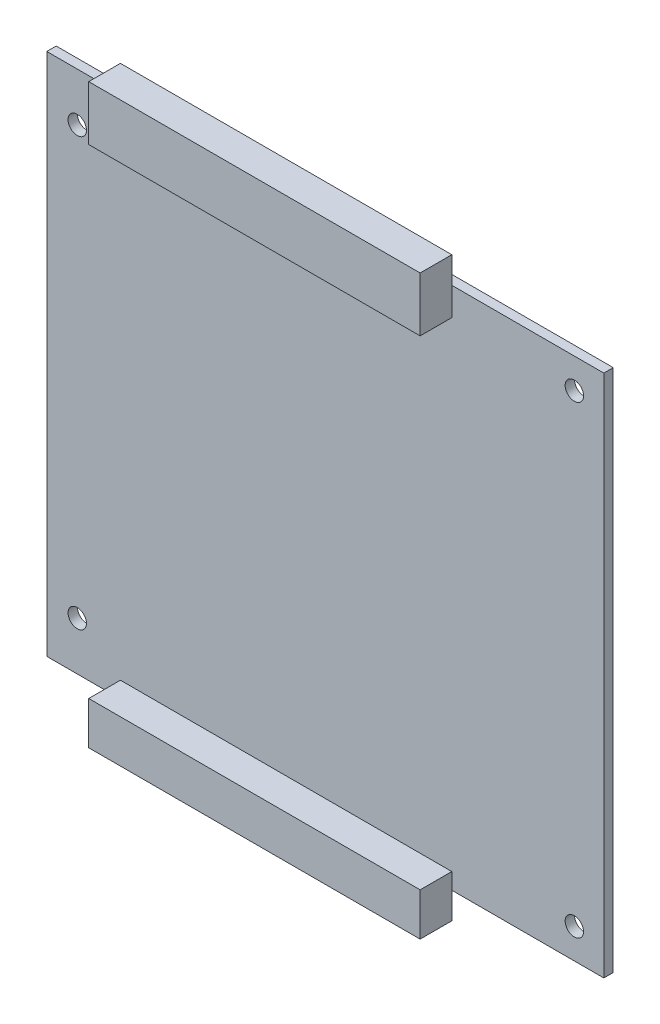
ISO-10303-21;
HEADER;
FILE_DESCRIPTION(('STEP AP214'),'2;1');
FILE_NAME('part.step','',(''),(''),'','','');
FILE_SCHEMA(('AUTOMOTIVE_DESIGN { 1 0 10303 214 1 1 1 1 }'));
ENDSEC;
DATA;
#1=APPLICATION_CONTEXT('core data for automotive mechanical design processes');
#2=APPLICATION_PROTOCOL_DEFINITION('international standard','automotive_design',2000,#1);
#3=PRODUCT_CONTEXT('',#1,'mechanical');
#4=PRODUCT('Part','Part','',(#3));
#5=PRODUCT_RELATED_PRODUCT_CATEGORY('part','',(#4));
#6=PRODUCT_DEFINITION_FORMATION('','',#4);
#7=PRODUCT_DEFINITION_CONTEXT('part definition',#1,'design');
#8=PRODUCT_DEFINITION('design','',#6,#7);
#9=PRODUCT_DEFINITION_SHAPE('','',#8);
#10=(LENGTH_UNIT() NAMED_UNIT(*) SI_UNIT(.MILLI.,.METRE.));
#11=(NAMED_UNIT(*) PLANE_ANGLE_UNIT() SI_UNIT($,.RADIAN.));
#12=(NAMED_UNIT(*) SI_UNIT($,.STERADIAN.) SOLID_ANGLE_UNIT());
#13=UNCERTAINTY_MEASURE_WITH_UNIT(LENGTH_MEASURE(1.E-05),#10,'distance_accuracy_value','');
#14=(GEOMETRIC_REPRESENTATION_CONTEXT(3) GLOBAL_UNCERTAINTY_ASSIGNED_CONTEXT((#13)) GLOBAL_UNIT_ASSIGNED_CONTEXT((#10,
#11,#12)) REPRESENTATION_CONTEXT('',''));
#15=CARTESIAN_POINT('',(0.,0.,0.));
#16=DIRECTION('',(0.,0.,1.));
#17=DIRECTION('',(1.,0.,0.));
#18=AXIS2_PLACEMENT_3D('',#15,#16,#17);
#19=CARTESIAN_POINT('',(48.0314,45.1739,1.6256));
#20=DIRECTION('',(0.,0.,-1.));
#21=DIRECTION('',(-1.,0.,0.));
#22=AXIS2_PLACEMENT_3D('',#19,#20,#21);
#23=PLANE('',#22);
#24=CARTESIAN_POINT('',(-42.7736,-36.83,1.6256));
#25=DIRECTION('',(0.,0.,1.));
#26=DIRECTION('',(1.,0.,0.));
#27=AXIS2_PLACEMENT_3D('',#24,#25,#26);
#28=CIRCLE('',#27,1.5875);
#29=CARTESIAN_POINT('',(-41.1861,-36.83,1.6256));
#30=VERTEX_POINT('',#29);
#31=EDGE_CURVE('E204',#30,#30,#28,.T.);
#32=ORIENTED_EDGE('',*,*,#31,.F.);
#33=EDGE_LOOP('',(#32));
#34=FACE_BOUND('',#33,.T.);
#35=CARTESIAN_POINT('',(42.9514,-40.005,1.6256));
#36=DIRECTION('',(0.,0.,1.));
#37=DIRECTION('',(1.,0.,0.));
#38=AXIS2_PLACEMENT_3D('',#35,#36,#37);
#39=CIRCLE('',#38,1.5875);
#40=CARTESIAN_POINT('',(44.5389,-40.005,1.6256));
#41=VERTEX_POINT('',#40);
#42=EDGE_CURVE('E208',#41,#41,#39,.T.);
#43=ORIENTED_EDGE('',*,*,#42,.F.);
#44=EDGE_LOOP('',(#43));
#45=FACE_BOUND('',#44,.T.);
#46=CARTESIAN_POINT('',(42.9514,40.005,1.6256));
#47=DIRECTION('',(0.,0.,1.));
#48=DIRECTION('',(1.,0.,0.));
#49=AXIS2_PLACEMENT_3D('',#46,#47,#48);
#50=CIRCLE('',#49,1.5875);
#51=CARTESIAN_POINT('',(44.5389,40.005,1.6256));
#52=VERTEX_POINT('',#51);
#53=EDGE_CURVE('E214',#52,#52,#50,.T.);
#54=ORIENTED_EDGE('',*,*,#53,.F.);
#55=EDGE_LOOP('',(#54));
#56=FACE_BOUND('',#55,.T.);
#57=CARTESIAN_POINT('',(-42.7736,36.83,1.6256));
#58=DIRECTION('',(0.,0.,1.));
#59=DIRECTION('',(1.,0.,0.));
#60=AXIS2_PLACEMENT_3D('',#57,#58,#59);
#61=CIRCLE('',#60,1.5875);
#62=CARTESIAN_POINT('',(-41.1861,36.83,1.6256));
#63=VERTEX_POINT('',#62);
#64=EDGE_CURVE('E220',#63,#63,#61,.T.);
#65=ORIENTED_EDGE('',*,*,#64,.F.);
#66=EDGE_LOOP('',(#65));
#67=FACE_BOUND('',#66,.T.);
#68=DIRECTION('',(0.,-1.,0.));
#69=VECTOR('',#68,1.);
#70=CARTESIAN_POINT('',(-35.3314,40.3479,1.6256));
#71=LINE('',#70,#69);
#72=CARTESIAN_POINT('',(-35.3314,45.1739,1.6256));
#73=VERTEX_POINT('',#72);
#74=CARTESIAN_POINT('',(-35.3314,40.3479,1.6256));
#75=VERTEX_POINT('',#74);
#76=EDGE_CURVE('E167',#73,#75,#71,.T.);
#77=ORIENTED_EDGE('',*,*,#76,.F.);
#78=DIRECTION('',(-1.,0.,0.));
#79=VECTOR('',#78,1.);
#80=CARTESIAN_POINT('',(-48.0314,45.1739,1.6256));
#81=LINE('',#80,#79);
#82=CARTESIAN_POINT('',(-48.0314,45.1739,1.6256));
#83=VERTEX_POINT('',#82);
#84=EDGE_CURVE('E232',#73,#83,#81,.T.);
#85=ORIENTED_EDGE('',*,*,#84,.T.);
#86=DIRECTION('',(0.,-1.,0.));
#87=VECTOR('',#86,1.);
#88=CARTESIAN_POINT('',(-48.0314,-45.1739,1.6256));
#89=LINE('',#88,#87);
#90=CARTESIAN_POINT('',(-48.0314,-45.1739,1.6256));
#91=VERTEX_POINT('',#90);
#92=EDGE_CURVE('E236',#83,#91,#89,.T.);
#93=ORIENTED_EDGE('',*,*,#92,.T.);
#94=DIRECTION('',(1.,0.,0.));
#95=VECTOR('',#94,1.);
#96=CARTESIAN_POINT('',(-48.0314,-45.1739,1.6256));
#97=LINE('',#96,#95);
#98=CARTESIAN_POINT('',(-35.3314,-45.1739,1.6256));
#99=VERTEX_POINT('',#98);
#100=EDGE_CURVE('E240',#91,#99,#97,.T.);
#101=ORIENTED_EDGE('',*,*,#100,.T.);
#102=DIRECTION('',(0.,-1.,0.));
#103=VECTOR('',#102,1.);
#104=CARTESIAN_POINT('',(-35.3314,-42.3799,1.6256));
#105=LINE('',#104,#103);
#106=CARTESIAN_POINT('',(-35.3314,-42.3799,1.6256));
#107=VERTEX_POINT('',#106);
#108=EDGE_CURVE('E170',#107,#99,#105,.T.);
#109=ORIENTED_EDGE('',*,*,#108,.F.);
#110=DIRECTION('',(-1.,0.,0.));
#111=VECTOR('',#110,1.);
#112=CARTESIAN_POINT('',(-35.3314,-42.3799,1.6256));
#113=LINE('',#112,#111);
#114=CARTESIAN_POINT('',(21.8186,-42.3799,1.6256));
#115=VERTEX_POINT('',#114);
#116=EDGE_CURVE('E180',#115,#107,#113,.T.);
#117=ORIENTED_EDGE('',*,*,#116,.F.);
#118=DIRECTION('',(0.,1.,0.));
#119=VECTOR('',#118,1.);
#120=CARTESIAN_POINT('',(21.8186,-42.3799,1.6256));
#121=LINE('',#120,#119);
#122=CARTESIAN_POINT('',(21.8186,-45.1739,1.6256));
#123=VERTEX_POINT('',#122);
#124=EDGE_CURVE('E11',#123,#115,#121,.T.);
#125=ORIENTED_EDGE('',*,*,#124,.F.);
#126=CARTESIAN_POINT('',(48.0314,-45.1739,1.6256));
#127=VERTEX_POINT('',#126);
#128=EDGE_CURVE('E239',#123,#127,#97,.T.);
#129=ORIENTED_EDGE('',*,*,#128,.T.);
#130=DIRECTION('',(0.,1.,0.));
#131=VECTOR('',#130,1.);
#132=CARTESIAN_POINT('',(48.0314,-45.1739,1.6256));
#133=LINE('',#132,#131);
#134=CARTESIAN_POINT('',(48.0314,45.1739,1.6256));
#135=VERTEX_POINT('',#134);
#136=EDGE_CURVE('E229',#127,#135,#133,.T.);
#137=ORIENTED_EDGE('',*,*,#136,.T.);
#138=CARTESIAN_POINT('',(21.8186,45.1739,1.6256));
#139=VERTEX_POINT('',#138);
#140=EDGE_CURVE('E234',#135,#139,#81,.T.);
#141=ORIENTED_EDGE('',*,*,#140,.T.);
#142=DIRECTION('',(0.,1.,0.));
#143=VECTOR('',#142,1.);
#144=CARTESIAN_POINT('',(21.8186,40.3479,1.6256));
#145=LINE('',#144,#143);
#146=CARTESIAN_POINT('',(21.8186,40.3479,1.6256));
#147=VERTEX_POINT('',#146);
#148=EDGE_CURVE('E62',#147,#139,#145,.T.);
#149=ORIENTED_EDGE('',*,*,#148,.F.);
#150=DIRECTION('',(1.,0.,0.));
#151=VECTOR('',#150,1.);
#152=CARTESIAN_POINT('',(-35.3314,40.3479,1.6256));
#153=LINE('',#152,#151);
#154=EDGE_CURVE('E57',#75,#147,#153,.T.);
#155=ORIENTED_EDGE('',*,*,#154,.F.);
#156=EDGE_LOOP('',(#77,#85,#93,#101,#109,#117,#125,#129,#137,#141,#149,#155));
#157=FACE_BOUND('',#156,.T.);
#158=ADVANCED_FACE('F40',(#34,#45,#56,#67,#157),#23,.F.);
#159=CARTESIAN_POINT('',(48.0314,-45.1739,1.6256));
#160=DIRECTION('',(-1.,0.,0.));
#161=DIRECTION('',(0.,0.,1.));
#162=AXIS2_PLACEMENT_3D('',#159,#160,#161);
#163=PLANE('',#162);
#164=DIRECTION('',(0.,1.,0.));
#165=VECTOR('',#164,1.);
#166=CARTESIAN_POINT('',(48.0314,-45.1739,0.));
#167=LINE('',#166,#165);
#168=CARTESIAN_POINT('',(48.0314,-45.1739,0.));
#169=VERTEX_POINT('',#168);
#170=CARTESIAN_POINT('',(48.0314,45.1739,0.));
#171=VERTEX_POINT('',#170);
#172=EDGE_CURVE('E226',#169,#171,#167,.T.);
#173=ORIENTED_EDGE('',*,*,#172,.T.);
#174=DIRECTION('',(0.,0.,-1.));
#175=VECTOR('',#174,1.);
#176=CARTESIAN_POINT('',(48.0314,45.1739,1.6256));
#177=LINE('',#176,#175);
#178=EDGE_CURVE('E44',#135,#171,#177,.T.);
#179=ORIENTED_EDGE('',*,*,#178,.F.);
#180=ORIENTED_EDGE('',*,*,#136,.F.);
#181=DIRECTION('',(0.,0.,-1.));
#182=VECTOR('',#181,1.);
#183=CARTESIAN_POINT('',(48.0314,-45.1739,1.6256));
#184=LINE('',#183,#182);
#185=EDGE_CURVE('E243',#127,#169,#184,.T.);
#186=ORIENTED_EDGE('',*,*,#185,.T.);
#187=EDGE_LOOP('',(#173,#179,#180,#186));
#188=FACE_BOUND('',#187,.T.);
#189=ADVANCED_FACE('F42',(#188),#163,.F.);
#190=CARTESIAN_POINT('',(-48.0314,45.1739,1.6256));
#191=DIRECTION('',(0.,-1.,0.));
#192=DIRECTION('',(0.,0.,-1.));
#193=AXIS2_PLACEMENT_3D('',#190,#191,#192);
#194=PLANE('',#193);
#195=DIRECTION('',(-1.,0.,0.));
#196=VECTOR('',#195,1.);
#197=CARTESIAN_POINT('',(-48.0314,45.1739,0.));
#198=LINE('',#197,#196);
#199=CARTESIAN_POINT('',(-48.0314,45.1739,0.));
#200=VERTEX_POINT('',#199);
#201=EDGE_CURVE('E247',#171,#200,#198,.T.);
#202=ORIENTED_EDGE('',*,*,#201,.T.);
#203=DIRECTION('',(0.,0.,-1.));
#204=VECTOR('',#203,1.);
#205=CARTESIAN_POINT('',(-48.0314,45.1739,1.6256));
#206=LINE('',#205,#204);
#207=EDGE_CURVE('E256',#83,#200,#206,.T.);
#208=ORIENTED_EDGE('',*,*,#207,.F.);
#209=ORIENTED_EDGE('',*,*,#84,.F.);
#210=EDGE_CURVE('E237',#139,#73,#81,.T.);
#211=ORIENTED_EDGE('',*,*,#210,.F.);
#212=ORIENTED_EDGE('',*,*,#140,.F.);
#213=ORIENTED_EDGE('',*,*,#178,.T.);
#214=EDGE_LOOP('',(#202,#208,#209,#211,#212,#213));
#215=FACE_BOUND('',#214,.T.);
#216=ADVANCED_FACE('F265',(#215),#194,.F.);
#217=CARTESIAN_POINT('',(-48.0314,-45.1739,1.6256));
#218=DIRECTION('',(1.,0.,0.));
#219=DIRECTION('',(0.,0.,-1.));
#220=AXIS2_PLACEMENT_3D('',#217,#218,#219);
#221=PLANE('',#220);
#222=DIRECTION('',(0.,-1.,0.));
#223=VECTOR('',#222,1.);
#224=CARTESIAN_POINT('',(-48.0314,-45.1739,0.));
#225=LINE('',#224,#223);
#226=CARTESIAN_POINT('',(-48.0314,-45.1739,0.));
#227=VERTEX_POINT('',#226);
#228=EDGE_CURVE('E249',#200,#227,#225,.T.);
#229=ORIENTED_EDGE('',*,*,#228,.T.);
#230=DIRECTION('',(0.,0.,-1.));
#231=VECTOR('',#230,1.);
#232=CARTESIAN_POINT('',(-48.0314,-45.1739,1.6256));
#233=LINE('',#232,#231);
#234=EDGE_CURVE('E254',#91,#227,#233,.T.);
#235=ORIENTED_EDGE('',*,*,#234,.F.);
#236=ORIENTED_EDGE('',*,*,#92,.F.);
#237=ORIENTED_EDGE('',*,*,#207,.T.);
#238=EDGE_LOOP('',(#229,#235,#236,#237));
#239=FACE_BOUND('',#238,.T.);
#240=ADVANCED_FACE('F274',(#239),#221,.F.);
#241=CARTESIAN_POINT('',(-48.0314,-45.1739,1.6256));
#242=DIRECTION('',(0.,1.,0.));
#243=DIRECTION('',(0.,0.,1.));
#244=AXIS2_PLACEMENT_3D('',#241,#242,#243);
#245=PLANE('',#244);
#246=DIRECTION('',(1.,0.,0.));
#247=VECTOR('',#246,1.);
#248=CARTESIAN_POINT('',(-48.0314,-45.1739,0.));
#249=LINE('',#248,#247);
#250=EDGE_CURVE('E233',#227,#169,#249,.T.);
#251=ORIENTED_EDGE('',*,*,#250,.T.);
#252=ORIENTED_EDGE('',*,*,#185,.F.);
#253=ORIENTED_EDGE('',*,*,#128,.F.);
#254=EDGE_CURVE('E244',#99,#123,#97,.T.);
#255=ORIENTED_EDGE('',*,*,#254,.F.);
#256=ORIENTED_EDGE('',*,*,#100,.F.);
#257=ORIENTED_EDGE('',*,*,#234,.T.);
#258=EDGE_LOOP('',(#251,#252,#253,#255,#256,#257));
#259=FACE_BOUND('',#258,.T.);
#260=ADVANCED_FACE('F277',(#259),#245,.F.);
#261=CARTESIAN_POINT('',(48.0314,45.1739,0.));
#262=DIRECTION('',(0.,0.,-1.));
#263=DIRECTION('',(-1.,0.,0.));
#264=AXIS2_PLACEMENT_3D('',#261,#262,#263);
#265=PLANE('',#264);
#266=CARTESIAN_POINT('',(-42.7736,-36.83,0.));
#267=DIRECTION('',(0.,0.,1.));
#268=DIRECTION('',(1.,0.,0.));
#269=AXIS2_PLACEMENT_3D('',#266,#267,#268);
#270=CIRCLE('',#269,1.5875);
#271=CARTESIAN_POINT('',(-41.1861,-36.83,0.));
#272=VERTEX_POINT('',#271);
#273=EDGE_CURVE('E205',#272,#272,#270,.T.);
#274=ORIENTED_EDGE('',*,*,#273,.T.);
#275=EDGE_LOOP('',(#274));
#276=FACE_BOUND('',#275,.T.);
#277=CARTESIAN_POINT('',(42.9514,-40.005,0.));
#278=DIRECTION('',(0.,0.,1.));
#279=DIRECTION('',(1.,0.,0.));
#280=AXIS2_PLACEMENT_3D('',#277,#278,#279);
#281=CIRCLE('',#280,1.5875);
#282=CARTESIAN_POINT('',(44.5389,-40.005,0.));
#283=VERTEX_POINT('',#282);
#284=EDGE_CURVE('E211',#283,#283,#281,.T.);
#285=ORIENTED_EDGE('',*,*,#284,.T.);
#286=EDGE_LOOP('',(#285));
#287=FACE_BOUND('',#286,.T.);
#288=CARTESIAN_POINT('',(42.9514,40.005,0.));
#289=DIRECTION('',(0.,0.,1.));
#290=DIRECTION('',(1.,0.,0.));
#291=AXIS2_PLACEMENT_3D('',#288,#289,#290);
#292=CIRCLE('',#291,1.5875);
#293=CARTESIAN_POINT('',(44.5389,40.005,0.));
#294=VERTEX_POINT('',#293);
#295=EDGE_CURVE('E217',#294,#294,#292,.T.);
#296=ORIENTED_EDGE('',*,*,#295,.T.);
#297=EDGE_LOOP('',(#296));
#298=FACE_BOUND('',#297,.T.);
#299=CARTESIAN_POINT('',(-42.7736,36.83,0.));
#300=DIRECTION('',(0.,0.,1.));
#301=DIRECTION('',(1.,0.,0.));
#302=AXIS2_PLACEMENT_3D('',#299,#300,#301);
#303=CIRCLE('',#302,1.5875);
#304=CARTESIAN_POINT('',(-41.1861,36.83,0.));
#305=VERTEX_POINT('',#304);
#306=EDGE_CURVE('E223',#305,#305,#303,.T.);
#307=ORIENTED_EDGE('',*,*,#306,.T.);
#308=EDGE_LOOP('',(#307));
#309=FACE_BOUND('',#308,.T.);
#310=ORIENTED_EDGE('',*,*,#172,.F.);
#311=ORIENTED_EDGE('',*,*,#250,.F.);
#312=ORIENTED_EDGE('',*,*,#228,.F.);
#313=ORIENTED_EDGE('',*,*,#201,.F.);
#314=EDGE_LOOP('',(#310,#311,#312,#313));
#315=FACE_BOUND('',#314,.T.);
#316=ADVANCED_FACE('F272',(#276,#287,#298,#309,#315),#265,.T.);
#317=CARTESIAN_POINT('',(-42.7736,36.83,0.));
#318=DIRECTION('',(0.,0.,1.));
#319=DIRECTION('',(1.,0.,0.));
#320=AXIS2_PLACEMENT_3D('',#317,#318,#319);
#321=CYLINDRICAL_SURFACE('',#320,1.5875);
#322=ORIENTED_EDGE('',*,*,#306,.F.);
#323=EDGE_LOOP('',(#322));
#324=FACE_BOUND('',#323,.T.);
#325=ORIENTED_EDGE('',*,*,#64,.T.);
#326=EDGE_LOOP('',(#325));
#327=FACE_BOUND('',#326,.T.);
#328=ADVANCED_FACE('F324',(#324,#327),#321,.F.);
#329=CARTESIAN_POINT('',(42.9514,40.005,0.));
#330=DIRECTION('',(0.,0.,1.));
#331=DIRECTION('',(1.,0.,0.));
#332=AXIS2_PLACEMENT_3D('',#329,#330,#331);
#333=CYLINDRICAL_SURFACE('',#332,1.5875);
#334=ORIENTED_EDGE('',*,*,#295,.F.);
#335=EDGE_LOOP('',(#334));
#336=FACE_BOUND('',#335,.T.);
#337=ORIENTED_EDGE('',*,*,#53,.T.);
#338=EDGE_LOOP('',(#337));
#339=FACE_BOUND('',#338,.T.);
#340=ADVANCED_FACE('F356',(#336,#339),#333,.F.);
#341=CARTESIAN_POINT('',(42.9514,-40.005,0.));
#342=DIRECTION('',(0.,0.,1.));
#343=DIRECTION('',(1.,0.,0.));
#344=AXIS2_PLACEMENT_3D('',#341,#342,#343);
#345=CYLINDRICAL_SURFACE('',#344,1.5875);
#346=ORIENTED_EDGE('',*,*,#284,.F.);
#347=EDGE_LOOP('',(#346));
#348=FACE_BOUND('',#347,.T.);
#349=ORIENTED_EDGE('',*,*,#42,.T.);
#350=EDGE_LOOP('',(#349));
#351=FACE_BOUND('',#350,.T.);
#352=ADVANCED_FACE('F363',(#348,#351),#345,.F.);
#353=CARTESIAN_POINT('',(-42.7736,-36.83,0.));
#354=DIRECTION('',(0.,0.,1.));
#355=DIRECTION('',(1.,0.,0.));
#356=AXIS2_PLACEMENT_3D('',#353,#354,#355);
#357=CYLINDRICAL_SURFACE('',#356,1.5875);
#358=ORIENTED_EDGE('',*,*,#273,.F.);
#359=EDGE_LOOP('',(#358));
#360=FACE_BOUND('',#359,.T.);
#361=ORIENTED_EDGE('',*,*,#31,.T.);
#362=EDGE_LOOP('',(#361));
#363=FACE_BOUND('',#362,.T.);
#364=ADVANCED_FACE('F370',(#360,#363),#357,.F.);
#365=CARTESIAN_POINT('',(-35.3314,-49.7459,1.6256));
#366=DIRECTION('',(0.,0.,1.));
#367=DIRECTION('',(1.,0.,0.));
#368=AXIS2_PLACEMENT_3D('',#365,#366,#367);
#369=PLANE('',#368);
#370=CARTESIAN_POINT('',(-35.3314,-49.7459,1.6256));
#371=VERTEX_POINT('',#370);
#372=EDGE_CURVE('E168',#99,#371,#105,.T.);
#373=ORIENTED_EDGE('',*,*,#372,.F.);
#374=ORIENTED_EDGE('',*,*,#254,.T.);
#375=CARTESIAN_POINT('',(21.8186,-49.7459,1.6256));
#376=VERTEX_POINT('',#375);
#377=EDGE_CURVE('E50',#376,#123,#121,.T.);
#378=ORIENTED_EDGE('',*,*,#377,.F.);
#379=DIRECTION('',(1.,0.,0.));
#380=VECTOR('',#379,1.);
#381=CARTESIAN_POINT('',(-35.3314,-49.7459,1.6256));
#382=LINE('',#381,#380);
#383=EDGE_CURVE('E188',#371,#376,#382,.T.);
#384=ORIENTED_EDGE('',*,*,#383,.F.);
#385=EDGE_LOOP('',(#373,#374,#378,#384));
#386=FACE_BOUND('',#385,.T.);
#387=ADVANCED_FACE('F283',(#386),#369,.F.);
#388=CARTESIAN_POINT('',(-35.3314,-42.3799,7.0866));
#389=DIRECTION('',(1.,0.,0.));
#390=DIRECTION('',(0.,0.,-1.));
#391=AXIS2_PLACEMENT_3D('',#388,#389,#390);
#392=PLANE('',#391);
#393=ORIENTED_EDGE('',*,*,#108,.T.);
#394=ORIENTED_EDGE('',*,*,#372,.T.);
#395=DIRECTION('',(0.,0.,-1.));
#396=VECTOR('',#395,1.);
#397=CARTESIAN_POINT('',(-35.3314,-49.7459,7.0866));
#398=LINE('',#397,#396);
#399=CARTESIAN_POINT('',(-35.3314,-49.7459,7.0866));
#400=VERTEX_POINT('',#399);
#401=EDGE_CURVE('E201',#400,#371,#398,.T.);
#402=ORIENTED_EDGE('',*,*,#401,.F.);
#403=DIRECTION('',(0.,-1.,0.));
#404=VECTOR('',#403,1.);
#405=CARTESIAN_POINT('',(-35.3314,-42.3799,7.0866));
#406=LINE('',#405,#404);
#407=CARTESIAN_POINT('',(-35.3314,-42.3799,7.0866));
#408=VERTEX_POINT('',#407);
#409=EDGE_CURVE('E176',#408,#400,#406,.T.);
#410=ORIENTED_EDGE('',*,*,#409,.F.);
#411=DIRECTION('',(0.,0.,-1.));
#412=VECTOR('',#411,1.);
#413=CARTESIAN_POINT('',(-35.3314,-42.3799,7.0866));
#414=LINE('',#413,#412);
#415=EDGE_CURVE('E185',#408,#107,#414,.T.);
#416=ORIENTED_EDGE('',*,*,#415,.T.);
#417=EDGE_LOOP('',(#393,#394,#402,#410,#416));
#418=FACE_BOUND('',#417,.T.);
#419=ADVANCED_FACE('F287',(#418),#392,.F.);
#420=CARTESIAN_POINT('',(-35.3314,-49.7459,7.0866));
#421=DIRECTION('',(0.,1.,0.));
#422=DIRECTION('',(0.,0.,1.));
#423=AXIS2_PLACEMENT_3D('',#420,#421,#422);
#424=PLANE('',#423);
#425=ORIENTED_EDGE('',*,*,#383,.T.);
#426=DIRECTION('',(0.,0.,-1.));
#427=VECTOR('',#426,1.);
#428=CARTESIAN_POINT('',(21.8186,-49.7459,7.0866));
#429=LINE('',#428,#427);
#430=CARTESIAN_POINT('',(21.8186,-49.7459,7.0866));
#431=VERTEX_POINT('',#430);
#432=EDGE_CURVE('E198',#431,#376,#429,.T.);
#433=ORIENTED_EDGE('',*,*,#432,.F.);
#434=DIRECTION('',(1.,0.,0.));
#435=VECTOR('',#434,1.);
#436=CARTESIAN_POINT('',(-35.3314,-49.7459,7.0866));
#437=LINE('',#436,#435);
#438=EDGE_CURVE('E179',#400,#431,#437,.T.);
#439=ORIENTED_EDGE('',*,*,#438,.F.);
#440=ORIENTED_EDGE('',*,*,#401,.T.);
#441=EDGE_LOOP('',(#425,#433,#439,#440));
#442=FACE_BOUND('',#441,.T.);
#443=ADVANCED_FACE('F299',(#442),#424,.F.);
#444=CARTESIAN_POINT('',(21.8186,-42.3799,7.0866));
#445=DIRECTION('',(-1.,0.,0.));
#446=DIRECTION('',(0.,-1.,0.));
#447=AXIS2_PLACEMENT_3D('',#444,#445,#446);
#448=PLANE('',#447);
#449=ORIENTED_EDGE('',*,*,#377,.T.);
#450=ORIENTED_EDGE('',*,*,#124,.T.);
#451=DIRECTION('',(0.,0.,-1.));
#452=VECTOR('',#451,1.);
#453=CARTESIAN_POINT('',(21.8186,-42.3799,7.0866));
#454=LINE('',#453,#452);
#455=CARTESIAN_POINT('',(21.8186,-42.3799,7.0866));
#456=VERTEX_POINT('',#455);
#457=EDGE_CURVE('E195',#456,#115,#454,.T.);
#458=ORIENTED_EDGE('',*,*,#457,.F.);
#459=DIRECTION('',(0.,1.,0.));
#460=VECTOR('',#459,1.);
#461=CARTESIAN_POINT('',(21.8186,-42.3799,7.0866));
#462=LINE('',#461,#460);
#463=EDGE_CURVE('E182',#431,#456,#462,.T.);
#464=ORIENTED_EDGE('',*,*,#463,.F.);
#465=ORIENTED_EDGE('',*,*,#432,.T.);
#466=EDGE_LOOP('',(#449,#450,#458,#464,#465));
#467=FACE_BOUND('',#466,.T.);
#468=ADVANCED_FACE('F295',(#467),#448,.F.);
#469=CARTESIAN_POINT('',(-35.3314,-42.3799,7.0866));
#470=DIRECTION('',(0.,-1.,0.));
#471=DIRECTION('',(0.,0.,-1.));
#472=AXIS2_PLACEMENT_3D('',#469,#470,#471);
#473=PLANE('',#472);
#474=ORIENTED_EDGE('',*,*,#116,.T.);
#475=ORIENTED_EDGE('',*,*,#415,.F.);
#476=DIRECTION('',(-1.,0.,0.));
#477=VECTOR('',#476,1.);
#478=CARTESIAN_POINT('',(-35.3314,-42.3799,7.0866));
#479=LINE('',#478,#477);
#480=EDGE_CURVE('E184',#456,#408,#479,.T.);
#481=ORIENTED_EDGE('',*,*,#480,.F.);
#482=ORIENTED_EDGE('',*,*,#457,.T.);
#483=EDGE_LOOP('',(#474,#475,#481,#482));
#484=FACE_BOUND('',#483,.T.);
#485=ADVANCED_FACE('F292',(#484),#473,.F.);
#486=CARTESIAN_POINT('',(-35.3314,-49.7459,7.0866));
#487=DIRECTION('',(0.,0.,1.));
#488=DIRECTION('',(1.,0.,0.));
#489=AXIS2_PLACEMENT_3D('',#486,#487,#488);
#490=PLANE('',#489);
#491=ORIENTED_EDGE('',*,*,#409,.T.);
#492=ORIENTED_EDGE('',*,*,#438,.T.);
#493=ORIENTED_EDGE('',*,*,#463,.T.);
#494=ORIENTED_EDGE('',*,*,#480,.T.);
#495=EDGE_LOOP('',(#491,#492,#493,#494));
#496=FACE_BOUND('',#495,.T.);
#497=ADVANCED_FACE('F301',(#496),#490,.T.);
#498=CARTESIAN_POINT('',(-35.3314,49.7459,1.6256));
#499=DIRECTION('',(0.,0.,-1.));
#500=DIRECTION('',(-1.,0.,0.));
#501=AXIS2_PLACEMENT_3D('',#498,#499,#500);
#502=PLANE('',#501);
#503=ORIENTED_EDGE('',*,*,#210,.T.);
#504=CARTESIAN_POINT('',(-35.3314,49.7459,1.6256));
#505=VERTEX_POINT('',#504);
#506=EDGE_CURVE('E471',#505,#73,#71,.T.);
#507=ORIENTED_EDGE('',*,*,#506,.F.);
#508=DIRECTION('',(-1.,0.,0.));
#509=VECTOR('',#508,1.);
#510=CARTESIAN_POINT('',(-35.3314,49.7459,1.6256));
#511=LINE('',#510,#509);
#512=CARTESIAN_POINT('',(21.8186,49.7459,1.6256));
#513=VERTEX_POINT('',#512);
#514=EDGE_CURVE('E163',#513,#505,#511,.T.);
#515=ORIENTED_EDGE('',*,*,#514,.F.);
#516=EDGE_CURVE('E475',#139,#513,#145,.T.);
#517=ORIENTED_EDGE('',*,*,#516,.F.);
#518=EDGE_LOOP('',(#503,#507,#515,#517));
#519=FACE_BOUND('',#518,.T.);
#520=ADVANCED_FACE('F303',(#519),#502,.T.);
#521=CARTESIAN_POINT('',(-35.3314,40.3479,7.0866));
#522=DIRECTION('',(1.,0.,0.));
#523=DIRECTION('',(0.,0.,-1.));
#524=AXIS2_PLACEMENT_3D('',#521,#522,#523);
#525=PLANE('',#524);
#526=ORIENTED_EDGE('',*,*,#506,.T.);
#527=ORIENTED_EDGE('',*,*,#76,.T.);
#528=DIRECTION('',(0.,0.,-1.));
#529=VECTOR('',#528,1.);
#530=CARTESIAN_POINT('',(-35.3314,40.3479,7.0866));
#531=LINE('',#530,#529);
#532=CARTESIAN_POINT('',(-35.3314,40.3479,7.0866));
#533=VERTEX_POINT('',#532);
#534=EDGE_CURVE('E148',#533,#75,#531,.T.);
#535=ORIENTED_EDGE('',*,*,#534,.F.);
#536=DIRECTION('',(0.,-1.,0.));
#537=VECTOR('',#536,1.);
#538=CARTESIAN_POINT('',(-35.3314,40.3479,7.0866));
#539=LINE('',#538,#537);
#540=CARTESIAN_POINT('',(-35.3314,49.7459,7.0866));
#541=VERTEX_POINT('',#540);
#542=EDGE_CURVE('E154',#541,#533,#539,.T.);
#543=ORIENTED_EDGE('',*,*,#542,.F.);
#544=DIRECTION('',(0.,0.,-1.));
#545=VECTOR('',#544,1.);
#546=CARTESIAN_POINT('',(-35.3314,49.7459,7.0866));
#547=LINE('',#546,#545);
#548=EDGE_CURVE('E466',#541,#505,#547,.T.);
#549=ORIENTED_EDGE('',*,*,#548,.T.);
#550=EDGE_LOOP('',(#526,#527,#535,#543,#549));
#551=FACE_BOUND('',#550,.T.);
#552=ADVANCED_FACE('F166',(#551),#525,.F.);
#553=CARTESIAN_POINT('',(-35.3314,40.3479,7.0866));
#554=DIRECTION('',(0.,1.,0.));
#555=DIRECTION('',(0.,0.,1.));
#556=AXIS2_PLACEMENT_3D('',#553,#554,#555);
#557=PLANE('',#556);
#558=ORIENTED_EDGE('',*,*,#154,.T.);
#559=DIRECTION('',(0.,0.,-1.));
#560=VECTOR('',#559,1.);
#561=CARTESIAN_POINT('',(21.8186,40.3479,7.0866));
#562=LINE('',#561,#560);
#563=CARTESIAN_POINT('',(21.8186,40.3479,7.0866));
#564=VERTEX_POINT('',#563);
#565=EDGE_CURVE('E150',#564,#147,#562,.T.);
#566=ORIENTED_EDGE('',*,*,#565,.F.);
#567=DIRECTION('',(1.,0.,0.));
#568=VECTOR('',#567,1.);
#569=CARTESIAN_POINT('',(-35.3314,40.3479,7.0866));
#570=LINE('',#569,#568);
#571=EDGE_CURVE('E144',#533,#564,#570,.T.);
#572=ORIENTED_EDGE('',*,*,#571,.F.);
#573=ORIENTED_EDGE('',*,*,#534,.T.);
#574=EDGE_LOOP('',(#558,#566,#572,#573));
#575=FACE_BOUND('',#574,.T.);
#576=ADVANCED_FACE('F146',(#575),#557,.F.);
#577=CARTESIAN_POINT('',(21.8186,40.3479,7.0866));
#578=DIRECTION('',(-1.,0.,0.));
#579=DIRECTION('',(0.,0.,1.));
#580=AXIS2_PLACEMENT_3D('',#577,#578,#579);
#581=PLANE('',#580);
#582=ORIENTED_EDGE('',*,*,#148,.T.);
#583=ORIENTED_EDGE('',*,*,#516,.T.);
#584=DIRECTION('',(0.,0.,-1.));
#585=VECTOR('',#584,1.);
#586=CARTESIAN_POINT('',(21.8186,49.7459,7.0866));
#587=LINE('',#586,#585);
#588=CARTESIAN_POINT('',(21.8186,49.7459,7.0866));
#589=VERTEX_POINT('',#588);
#590=EDGE_CURVE('E172',#589,#513,#587,.T.);
#591=ORIENTED_EDGE('',*,*,#590,.F.);
#592=DIRECTION('',(0.,1.,0.));
#593=VECTOR('',#592,1.);
#594=CARTESIAN_POINT('',(21.8186,40.3479,7.0866));
#595=LINE('',#594,#593);
#596=EDGE_CURVE('E153',#564,#589,#595,.T.);
#597=ORIENTED_EDGE('',*,*,#596,.F.);
#598=ORIENTED_EDGE('',*,*,#565,.T.);
#599=EDGE_LOOP('',(#582,#583,#591,#597,#598));
#600=FACE_BOUND('',#599,.T.);
#601=ADVANCED_FACE('F431',(#600),#581,.F.);
#602=CARTESIAN_POINT('',(-35.3314,49.7459,7.0866));
#603=DIRECTION('',(0.,-1.,0.));
#604=DIRECTION('',(0.,0.,-1.));
#605=AXIS2_PLACEMENT_3D('',#602,#603,#604);
#606=PLANE('',#605);
#607=ORIENTED_EDGE('',*,*,#514,.T.);
#608=ORIENTED_EDGE('',*,*,#548,.F.);
#609=DIRECTION('',(-1.,0.,0.));
#610=VECTOR('',#609,1.);
#611=CARTESIAN_POINT('',(-35.3314,49.7459,7.0866));
#612=LINE('',#611,#610);
#613=EDGE_CURVE('E159',#589,#541,#612,.T.);
#614=ORIENTED_EDGE('',*,*,#613,.F.);
#615=ORIENTED_EDGE('',*,*,#590,.T.);
#616=EDGE_LOOP('',(#607,#608,#614,#615));
#617=FACE_BOUND('',#616,.T.);
#618=ADVANCED_FACE('F441',(#617),#606,.F.);
#619=CARTESIAN_POINT('',(-35.3314,49.7459,7.0866));
#620=DIRECTION('',(0.,0.,-1.));
#621=DIRECTION('',(-1.,0.,0.));
#622=AXIS2_PLACEMENT_3D('',#619,#620,#621);
#623=PLANE('',#622);
#624=ORIENTED_EDGE('',*,*,#542,.T.);
#625=ORIENTED_EDGE('',*,*,#571,.T.);
#626=ORIENTED_EDGE('',*,*,#596,.T.);
#627=ORIENTED_EDGE('',*,*,#613,.T.);
#628=EDGE_LOOP('',(#624,#625,#626,#627));
#629=FACE_BOUND('',#628,.T.);
#630=ADVANCED_FACE('F157',(#629),#623,.F.);
#631=CLOSED_SHELL('',(#158,#189,#216,#240,#260,#316,#328,#340,#352,#364,#387,#419,#443,#468,
#485,#497,#520,#552,#576,#601,#618,#630));
#632=MANIFOLD_SOLID_BREP('B2',#631);
#633=ADVANCED_BREP_SHAPE_REPRESENTATION('',(#18,#632),#14);
#634=SHAPE_DEFINITION_REPRESENTATION(#9,#633);
ENDSEC;
END-ISO-10303-21;
